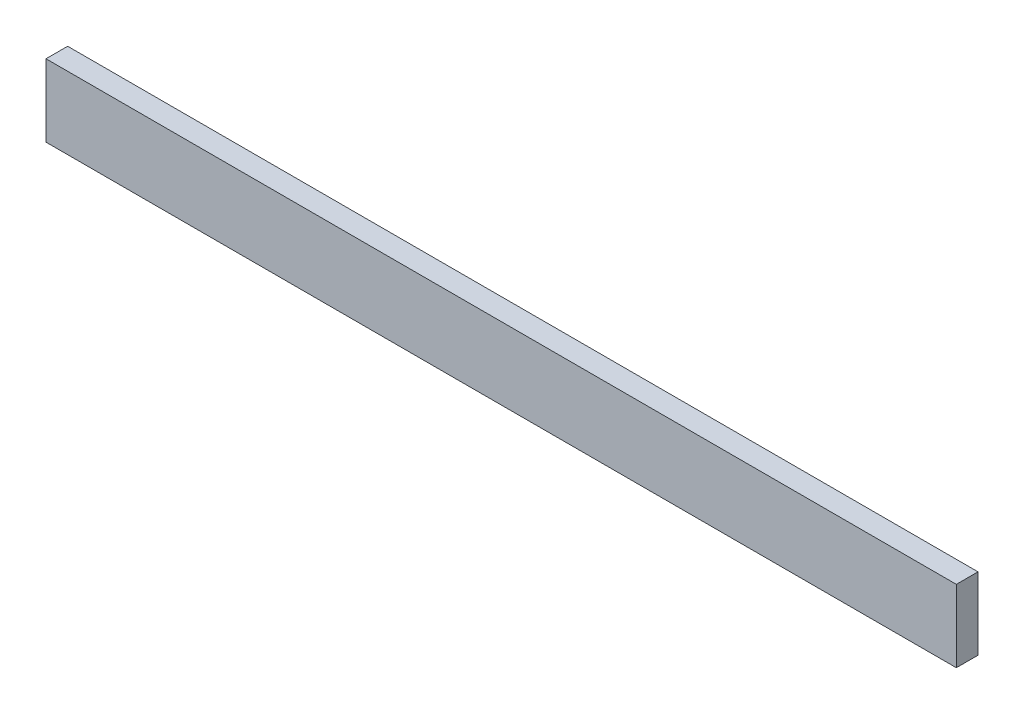
ISO-10303-21;
HEADER;
FILE_DESCRIPTION(('STEP AP214'),'2;1');
FILE_NAME('part.step','',(''),(''),'','','');
FILE_SCHEMA(('AUTOMOTIVE_DESIGN { 1 0 10303 214 1 1 1 1 }'));
ENDSEC;
DATA;
#1=APPLICATION_CONTEXT('core data for automotive mechanical design processes');
#2=APPLICATION_PROTOCOL_DEFINITION('international standard','automotive_design',2000,#1);
#3=PRODUCT_CONTEXT('',#1,'mechanical');
#4=PRODUCT('Part','Part','',(#3));
#5=PRODUCT_RELATED_PRODUCT_CATEGORY('part','',(#4));
#6=PRODUCT_DEFINITION_FORMATION('','',#4);
#7=PRODUCT_DEFINITION_CONTEXT('part definition',#1,'design');
#8=PRODUCT_DEFINITION('design','',#6,#7);
#9=PRODUCT_DEFINITION_SHAPE('','',#8);
#10=(LENGTH_UNIT() NAMED_UNIT(*) SI_UNIT(.MILLI.,.METRE.));
#11=(NAMED_UNIT(*) PLANE_ANGLE_UNIT() SI_UNIT($,.RADIAN.));
#12=(NAMED_UNIT(*) SI_UNIT($,.STERADIAN.) SOLID_ANGLE_UNIT());
#13=UNCERTAINTY_MEASURE_WITH_UNIT(LENGTH_MEASURE(1.E-05),#10,'distance_accuracy_value','');
#14=(GEOMETRIC_REPRESENTATION_CONTEXT(3) GLOBAL_UNCERTAINTY_ASSIGNED_CONTEXT((#13)) GLOBAL_UNIT_ASSIGNED_CONTEXT((#10,
#11,#12)) REPRESENTATION_CONTEXT('',''));
#15=CARTESIAN_POINT('',(0.,0.,0.));
#16=DIRECTION('',(0.,0.,1.));
#17=DIRECTION('',(1.,0.,0.));
#18=AXIS2_PLACEMENT_3D('',#15,#16,#17);
#19=CARTESIAN_POINT('',(80.01,6.35,3.81));
#20=DIRECTION('',(-1.,0.,0.));
#21=DIRECTION('',(0.,0.,1.));
#22=AXIS2_PLACEMENT_3D('',#19,#20,#21);
#23=PLANE('',#22);
#24=DIRECTION('',(0.,1.,0.));
#25=VECTOR('',#24,1.);
#26=CARTESIAN_POINT('',(80.01,6.35,0.));
#27=LINE('',#26,#25);
#28=CARTESIAN_POINT('',(80.01,-6.35,0.));
#29=VERTEX_POINT('',#28);
#30=CARTESIAN_POINT('',(80.01,6.35,0.));
#31=VERTEX_POINT('',#30);
#32=EDGE_CURVE('E111',#29,#31,#27,.T.);
#33=ORIENTED_EDGE('',*,*,#32,.T.);
#34=DIRECTION('',(0.,0.,-1.));
#35=VECTOR('',#34,1.);
#36=CARTESIAN_POINT('',(80.01,6.35,3.81));
#37=LINE('',#36,#35);
#38=CARTESIAN_POINT('',(80.01,6.35,3.81));
#39=VERTEX_POINT('',#38);
#40=EDGE_CURVE('E11',#39,#31,#37,.T.);
#41=ORIENTED_EDGE('',*,*,#40,.F.);
#42=DIRECTION('',(0.,1.,0.));
#43=VECTOR('',#42,1.);
#44=CARTESIAN_POINT('',(80.01,6.35,3.81));
#45=LINE('',#44,#43);
#46=CARTESIAN_POINT('',(80.01,-6.35,3.81));
#47=VERTEX_POINT('',#46);
#48=EDGE_CURVE('E100',#47,#39,#45,.T.);
#49=ORIENTED_EDGE('',*,*,#48,.F.);
#50=DIRECTION('',(0.,0.,-1.));
#51=VECTOR('',#50,1.);
#52=CARTESIAN_POINT('',(80.01,-6.35,3.81));
#53=LINE('',#52,#51);
#54=EDGE_CURVE('E108',#47,#29,#53,.T.);
#55=ORIENTED_EDGE('',*,*,#54,.T.);
#56=EDGE_LOOP('',(#33,#41,#49,#55));
#57=FACE_BOUND('',#56,.T.);
#58=ADVANCED_FACE('F44',(#57),#23,.F.);
#59=CARTESIAN_POINT('',(-80.01,6.35,3.81));
#60=DIRECTION('',(0.,-1.,0.));
#61=DIRECTION('',(0.,0.,-1.));
#62=AXIS2_PLACEMENT_3D('',#59,#60,#61);
#63=PLANE('',#62);
#64=DIRECTION('',(-1.,0.,0.));
#65=VECTOR('',#64,1.);
#66=CARTESIAN_POINT('',(-80.01,6.35,0.));
#67=LINE('',#66,#65);
#68=CARTESIAN_POINT('',(-80.01,6.35,0.));
#69=VERTEX_POINT('',#68);
#70=EDGE_CURVE('E105',#31,#69,#67,.T.);
#71=ORIENTED_EDGE('',*,*,#70,.T.);
#72=DIRECTION('',(0.,0.,-1.));
#73=VECTOR('',#72,1.);
#74=CARTESIAN_POINT('',(-80.01,6.35,3.81));
#75=LINE('',#74,#73);
#76=CARTESIAN_POINT('',(-80.01,6.35,3.81));
#77=VERTEX_POINT('',#76);
#78=EDGE_CURVE('E53',#77,#69,#75,.T.);
#79=ORIENTED_EDGE('',*,*,#78,.F.);
#80=DIRECTION('',(-1.,0.,0.));
#81=VECTOR('',#80,1.);
#82=CARTESIAN_POINT('',(-80.01,6.35,3.81));
#83=LINE('',#82,#81);
#84=EDGE_CURVE('E95',#39,#77,#83,.T.);
#85=ORIENTED_EDGE('',*,*,#84,.F.);
#86=ORIENTED_EDGE('',*,*,#40,.T.);
#87=EDGE_LOOP('',(#71,#79,#85,#86));
#88=FACE_BOUND('',#87,.T.);
#89=ADVANCED_FACE('F102',(#88),#63,.F.);
#90=CARTESIAN_POINT('',(-80.01,6.35,3.81));
#91=DIRECTION('',(1.,0.,0.));
#92=DIRECTION('',(0.,0.,-1.));
#93=AXIS2_PLACEMENT_3D('',#90,#91,#92);
#94=PLANE('',#93);
#95=DIRECTION('',(0.,-1.,0.));
#96=VECTOR('',#95,1.);
#97=CARTESIAN_POINT('',(-80.01,6.35,0.));
#98=LINE('',#97,#96);
#99=CARTESIAN_POINT('',(-80.01,-6.35,0.));
#100=VERTEX_POINT('',#99);
#101=EDGE_CURVE('E80',#69,#100,#98,.T.);
#102=ORIENTED_EDGE('',*,*,#101,.T.);
#103=DIRECTION('',(0.,0.,-1.));
#104=VECTOR('',#103,1.);
#105=CARTESIAN_POINT('',(-80.01,-6.35,3.81));
#106=LINE('',#105,#104);
#107=CARTESIAN_POINT('',(-80.01,-6.35,3.81));
#108=VERTEX_POINT('',#107);
#109=EDGE_CURVE('E101',#108,#100,#106,.T.);
#110=ORIENTED_EDGE('',*,*,#109,.F.);
#111=DIRECTION('',(0.,-1.,0.));
#112=VECTOR('',#111,1.);
#113=CARTESIAN_POINT('',(-80.01,6.35,3.81));
#114=LINE('',#113,#112);
#115=EDGE_CURVE('E94',#77,#108,#114,.T.);
#116=ORIENTED_EDGE('',*,*,#115,.F.);
#117=ORIENTED_EDGE('',*,*,#78,.T.);
#118=EDGE_LOOP('',(#102,#110,#116,#117));
#119=FACE_BOUND('',#118,.T.);
#120=ADVANCED_FACE('F103',(#119),#94,.F.);
#121=CARTESIAN_POINT('',(-80.01,-6.35,3.81));
#122=DIRECTION('',(0.,1.,0.));
#123=DIRECTION('',(0.,0.,1.));
#124=AXIS2_PLACEMENT_3D('',#121,#122,#123);
#125=PLANE('',#124);
#126=DIRECTION('',(1.,0.,0.));
#127=VECTOR('',#126,1.);
#128=CARTESIAN_POINT('',(-80.01,-6.35,0.));
#129=LINE('',#128,#127);
#130=EDGE_CURVE('E82',#100,#29,#129,.T.);
#131=ORIENTED_EDGE('',*,*,#130,.T.);
#132=ORIENTED_EDGE('',*,*,#54,.F.);
#133=DIRECTION('',(1.,0.,0.));
#134=VECTOR('',#133,1.);
#135=CARTESIAN_POINT('',(-80.01,-6.35,3.81));
#136=LINE('',#135,#134);
#137=EDGE_CURVE('E62',#108,#47,#136,.T.);
#138=ORIENTED_EDGE('',*,*,#137,.F.);
#139=ORIENTED_EDGE('',*,*,#109,.T.);
#140=EDGE_LOOP('',(#131,#132,#138,#139));
#141=FACE_BOUND('',#140,.T.);
#142=ADVANCED_FACE('F128',(#141),#125,.F.);
#143=CARTESIAN_POINT('',(0.,0.,3.81));
#144=DIRECTION('',(0.,0.,1.));
#145=DIRECTION('',(1.,0.,0.));
#146=AXIS2_PLACEMENT_3D('',#143,#144,#145);
#147=PLANE('',#146);
#148=ORIENTED_EDGE('',*,*,#48,.T.);
#149=ORIENTED_EDGE('',*,*,#84,.T.);
#150=ORIENTED_EDGE('',*,*,#115,.T.);
#151=ORIENTED_EDGE('',*,*,#137,.T.);
#152=EDGE_LOOP('',(#148,#149,#150,#151));
#153=FACE_BOUND('',#152,.T.);
#154=ADVANCED_FACE('F93',(#153),#147,.T.);
#155=CARTESIAN_POINT('',(0.,0.,0.));
#156=DIRECTION('',(0.,0.,1.));
#157=DIRECTION('',(1.,0.,0.));
#158=AXIS2_PLACEMENT_3D('',#155,#156,#157);
#159=PLANE('',#158);
#160=ORIENTED_EDGE('',*,*,#32,.F.);
#161=ORIENTED_EDGE('',*,*,#130,.F.);
#162=ORIENTED_EDGE('',*,*,#101,.F.);
#163=ORIENTED_EDGE('',*,*,#70,.F.);
#164=EDGE_LOOP('',(#160,#161,#162,#163));
#165=FACE_BOUND('',#164,.T.);
#166=ADVANCED_FACE('F129',(#165),#159,.F.);
#167=CLOSED_SHELL('',(#58,#89,#120,#142,#154,#166));
#168=MANIFOLD_SOLID_BREP('B2',#167);
#169=ADVANCED_BREP_SHAPE_REPRESENTATION('',(#18,#168),#14);
#170=SHAPE_DEFINITION_REPRESENTATION(#9,#169);
ENDSEC;
END-ISO-10303-21;
